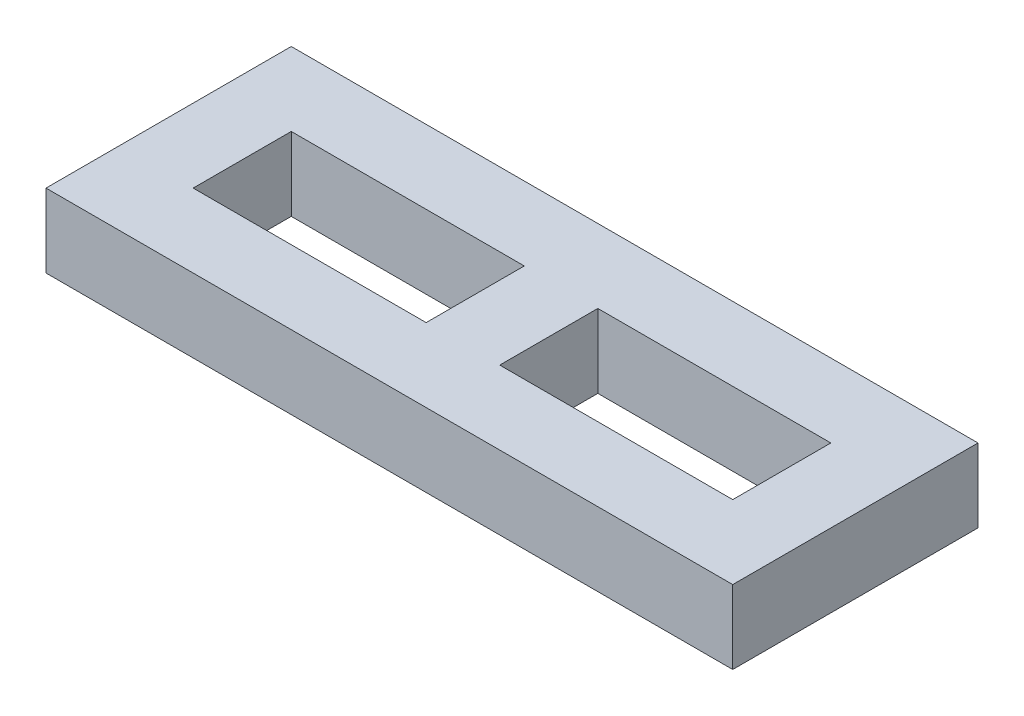
ISO-10303-21;
HEADER;
FILE_DESCRIPTION(('STEP AP214'),'2;1');
FILE_NAME('part.step','',(''),(''),'','','');
FILE_SCHEMA(('AUTOMOTIVE_DESIGN { 1 0 10303 214 1 1 1 1 }'));
ENDSEC;
DATA;
#1=APPLICATION_CONTEXT('core data for automotive mechanical design processes');
#2=APPLICATION_PROTOCOL_DEFINITION('international standard','automotive_design',2000,#1);
#3=PRODUCT_CONTEXT('',#1,'mechanical');
#4=PRODUCT('Part','Part','',(#3));
#5=PRODUCT_RELATED_PRODUCT_CATEGORY('part','',(#4));
#6=PRODUCT_DEFINITION_FORMATION('','',#4);
#7=PRODUCT_DEFINITION_CONTEXT('part definition',#1,'design');
#8=PRODUCT_DEFINITION('design','',#6,#7);
#9=PRODUCT_DEFINITION_SHAPE('','',#8);
#10=(LENGTH_UNIT() NAMED_UNIT(*) SI_UNIT(.MILLI.,.METRE.));
#11=(NAMED_UNIT(*) PLANE_ANGLE_UNIT() SI_UNIT($,.RADIAN.));
#12=(NAMED_UNIT(*) SI_UNIT($,.STERADIAN.) SOLID_ANGLE_UNIT());
#13=UNCERTAINTY_MEASURE_WITH_UNIT(LENGTH_MEASURE(1.E-05),#10,'distance_accuracy_value','');
#14=(GEOMETRIC_REPRESENTATION_CONTEXT(3) GLOBAL_UNCERTAINTY_ASSIGNED_CONTEXT((#13)) GLOBAL_UNIT_ASSIGNED_CONTEXT((#10,
#11,#12)) REPRESENTATION_CONTEXT('',''));
#15=CARTESIAN_POINT('',(0.,0.,0.));
#16=DIRECTION('',(0.,0.,1.));
#17=DIRECTION('',(1.,0.,0.));
#18=AXIS2_PLACEMENT_3D('',#15,#16,#17);
#19=CARTESIAN_POINT('',(88.9,-9.525,-31.75));
#20=DIRECTION('',(0.,0.,1.));
#21=DIRECTION('',(1.,0.,0.));
#22=AXIS2_PLACEMENT_3D('',#19,#20,#21);
#23=PLANE('',#22);
#24=DIRECTION('',(0.,1.,0.));
#25=VECTOR('',#24,1.);
#26=CARTESIAN_POINT('',(-88.9,-9.525,-31.75));
#27=LINE('',#26,#25);
#28=CARTESIAN_POINT('',(-88.9,-9.525,-31.75));
#29=VERTEX_POINT('',#28);
#30=CARTESIAN_POINT('',(-88.9,9.525,-31.75));
#31=VERTEX_POINT('',#30);
#32=EDGE_CURVE('E184',#29,#31,#27,.T.);
#33=ORIENTED_EDGE('',*,*,#32,.T.);
#34=DIRECTION('',(-1.,0.,0.));
#35=VECTOR('',#34,1.);
#36=CARTESIAN_POINT('',(88.9,9.525,-31.75));
#37=LINE('',#36,#35);
#38=CARTESIAN_POINT('',(88.9,9.525,-31.75));
#39=VERTEX_POINT('',#38);
#40=EDGE_CURVE('E11',#39,#31,#37,.T.);
#41=ORIENTED_EDGE('',*,*,#40,.F.);
#42=DIRECTION('',(0.,1.,0.));
#43=VECTOR('',#42,1.);
#44=CARTESIAN_POINT('',(88.9,-9.525,-31.75));
#45=LINE('',#44,#43);
#46=CARTESIAN_POINT('',(88.9,-9.525,-31.75));
#47=VERTEX_POINT('',#46);
#48=EDGE_CURVE('E191',#47,#39,#45,.T.);
#49=ORIENTED_EDGE('',*,*,#48,.F.);
#50=DIRECTION('',(-1.,0.,0.));
#51=VECTOR('',#50,1.);
#52=CARTESIAN_POINT('',(88.9,-9.525,-31.75));
#53=LINE('',#52,#51);
#54=EDGE_CURVE('E201',#47,#29,#53,.T.);
#55=ORIENTED_EDGE('',*,*,#54,.T.);
#56=EDGE_LOOP('',(#33,#41,#49,#55));
#57=FACE_BOUND('',#56,.T.);
#58=ADVANCED_FACE('F34',(#57),#23,.F.);
#59=CARTESIAN_POINT('',(88.9,9.525,31.75));
#60=DIRECTION('',(0.,-1.,0.));
#61=DIRECTION('',(0.,0.,-1.));
#62=AXIS2_PLACEMENT_3D('',#59,#60,#61);
#63=PLANE('',#62);
#64=DIRECTION('',(1.,0.,0.));
#65=VECTOR('',#64,1.);
#66=CARTESIAN_POINT('',(9.525,9.525,12.7));
#67=LINE('',#66,#65);
#68=CARTESIAN_POINT('',(9.52500000000001,9.525,12.7));
#69=VERTEX_POINT('',#68);
#70=CARTESIAN_POINT('',(69.85,9.525,12.7));
#71=VERTEX_POINT('',#70);
#72=EDGE_CURVE('E149',#69,#71,#67,.T.);
#73=ORIENTED_EDGE('',*,*,#72,.F.);
#74=DIRECTION('',(0.,0.,1.));
#75=VECTOR('',#74,1.);
#76=CARTESIAN_POINT('',(9.525,9.525,-12.7));
#77=LINE('',#76,#75);
#78=CARTESIAN_POINT('',(9.525,9.525,-12.7));
#79=VERTEX_POINT('',#78);
#80=EDGE_CURVE('E48',#79,#69,#77,.T.);
#81=ORIENTED_EDGE('',*,*,#80,.F.);
#82=DIRECTION('',(-1.,0.,0.));
#83=VECTOR('',#82,1.);
#84=CARTESIAN_POINT('',(9.525,9.525,-12.7));
#85=LINE('',#84,#83);
#86=CARTESIAN_POINT('',(69.85,9.525,-12.7));
#87=VERTEX_POINT('',#86);
#88=EDGE_CURVE('E140',#87,#79,#85,.T.);
#89=ORIENTED_EDGE('',*,*,#88,.F.);
#90=DIRECTION('',(0.,0.,-1.));
#91=VECTOR('',#90,1.);
#92=CARTESIAN_POINT('',(69.85,9.525,-12.7));
#93=LINE('',#92,#91);
#94=EDGE_CURVE('E143',#71,#87,#93,.T.);
#95=ORIENTED_EDGE('',*,*,#94,.F.);
#96=EDGE_LOOP('',(#73,#81,#89,#95));
#97=FACE_BOUND('',#96,.T.);
#98=DIRECTION('',(1.,0.,0.));
#99=VECTOR('',#98,1.);
#100=CARTESIAN_POINT('',(-69.85,9.525,12.7));
#101=LINE('',#100,#99);
#102=CARTESIAN_POINT('',(-69.85,9.525,12.7));
#103=VERTEX_POINT('',#102);
#104=CARTESIAN_POINT('',(-9.525,9.525,12.7));
#105=VERTEX_POINT('',#104);
#106=EDGE_CURVE('E174',#103,#105,#101,.T.);
#107=ORIENTED_EDGE('',*,*,#106,.F.);
#108=DIRECTION('',(0.,0.,1.));
#109=VECTOR('',#108,1.);
#110=CARTESIAN_POINT('',(-69.85,9.525,-12.7));
#111=LINE('',#110,#109);
#112=CARTESIAN_POINT('',(-69.85,9.525,-12.7));
#113=VERTEX_POINT('',#112);
#114=EDGE_CURVE('E155',#113,#103,#111,.T.);
#115=ORIENTED_EDGE('',*,*,#114,.F.);
#116=DIRECTION('',(-1.,0.,0.));
#117=VECTOR('',#116,1.);
#118=CARTESIAN_POINT('',(-69.85,9.525,-12.7));
#119=LINE('',#118,#117);
#120=CARTESIAN_POINT('',(-9.525,9.525,-12.7));
#121=VERTEX_POINT('',#120);
#122=EDGE_CURVE('E163',#121,#113,#119,.T.);
#123=ORIENTED_EDGE('',*,*,#122,.F.);
#124=DIRECTION('',(0.,0.,-1.));
#125=VECTOR('',#124,1.);
#126=CARTESIAN_POINT('',(-9.525,9.525,-12.7));
#127=LINE('',#126,#125);
#128=EDGE_CURVE('E177',#105,#121,#127,.T.);
#129=ORIENTED_EDGE('',*,*,#128,.F.);
#130=EDGE_LOOP('',(#107,#115,#123,#129));
#131=FACE_BOUND('',#130,.T.);
#132=DIRECTION('',(0.,0.,1.));
#133=VECTOR('',#132,1.);
#134=CARTESIAN_POINT('',(-88.9,9.525,31.75));
#135=LINE('',#134,#133);
#136=CARTESIAN_POINT('',(-88.9,9.525,31.75));
#137=VERTEX_POINT('',#136);
#138=EDGE_CURVE('E204',#31,#137,#135,.T.);
#139=ORIENTED_EDGE('',*,*,#138,.T.);
#140=DIRECTION('',(-1.,0.,0.));
#141=VECTOR('',#140,1.);
#142=CARTESIAN_POINT('',(88.9,9.525,31.75));
#143=LINE('',#142,#141);
#144=CARTESIAN_POINT('',(88.9,9.525,31.75));
#145=VERTEX_POINT('',#144);
#146=EDGE_CURVE('E41',#145,#137,#143,.T.);
#147=ORIENTED_EDGE('',*,*,#146,.F.);
#148=DIRECTION('',(0.,0.,1.));
#149=VECTOR('',#148,1.);
#150=CARTESIAN_POINT('',(88.9,9.525,31.75));
#151=LINE('',#150,#149);
#152=EDGE_CURVE('E194',#39,#145,#151,.T.);
#153=ORIENTED_EDGE('',*,*,#152,.F.);
#154=ORIENTED_EDGE('',*,*,#40,.T.);
#155=EDGE_LOOP('',(#139,#147,#153,#154));
#156=FACE_BOUND('',#155,.T.);
#157=ADVANCED_FACE('F233',(#97,#131,#156),#63,.F.);
#158=CARTESIAN_POINT('',(88.9,-9.525,31.75));
#159=DIRECTION('',(0.,0.,-1.));
#160=DIRECTION('',(-1.,0.,0.));
#161=AXIS2_PLACEMENT_3D('',#158,#159,#160);
#162=PLANE('',#161);
#163=DIRECTION('',(0.,-1.,0.));
#164=VECTOR('',#163,1.);
#165=CARTESIAN_POINT('',(-88.9,-9.525,31.75));
#166=LINE('',#165,#164);
#167=CARTESIAN_POINT('',(-88.9,-9.525,31.75));
#168=VERTEX_POINT('',#167);
#169=EDGE_CURVE('E206',#137,#168,#166,.T.);
#170=ORIENTED_EDGE('',*,*,#169,.T.);
#171=DIRECTION('',(-1.,0.,0.));
#172=VECTOR('',#171,1.);
#173=CARTESIAN_POINT('',(88.9,-9.525,31.75));
#174=LINE('',#173,#172);
#175=CARTESIAN_POINT('',(88.9,-9.525,31.75));
#176=VERTEX_POINT('',#175);
#177=EDGE_CURVE('E211',#176,#168,#174,.T.);
#178=ORIENTED_EDGE('',*,*,#177,.F.);
#179=DIRECTION('',(0.,-1.,0.));
#180=VECTOR('',#179,1.);
#181=CARTESIAN_POINT('',(88.9,-9.525,31.75));
#182=LINE('',#181,#180);
#183=EDGE_CURVE('E197',#145,#176,#182,.T.);
#184=ORIENTED_EDGE('',*,*,#183,.F.);
#185=ORIENTED_EDGE('',*,*,#146,.T.);
#186=EDGE_LOOP('',(#170,#178,#184,#185));
#187=FACE_BOUND('',#186,.T.);
#188=ADVANCED_FACE('F218',(#187),#162,.F.);
#189=CARTESIAN_POINT('',(88.9,-9.525,31.75));
#190=DIRECTION('',(0.,1.,0.));
#191=DIRECTION('',(0.,0.,1.));
#192=AXIS2_PLACEMENT_3D('',#189,#190,#191);
#193=PLANE('',#192);
#194=DIRECTION('',(-1.,0.,0.));
#195=VECTOR('',#194,1.);
#196=CARTESIAN_POINT('',(9.525,-9.525,-12.7));
#197=LINE('',#196,#195);
#198=CARTESIAN_POINT('',(69.85,-9.525,-12.7));
#199=VERTEX_POINT('',#198);
#200=CARTESIAN_POINT('',(9.525,-9.525,-12.7));
#201=VERTEX_POINT('',#200);
#202=EDGE_CURVE('E130',#199,#201,#197,.T.);
#203=ORIENTED_EDGE('',*,*,#202,.T.);
#204=DIRECTION('',(0.,0.,1.));
#205=VECTOR('',#204,1.);
#206=CARTESIAN_POINT('',(9.525,-9.525,-12.7));
#207=LINE('',#206,#205);
#208=CARTESIAN_POINT('',(9.525,-9.525,12.7));
#209=VERTEX_POINT('',#208);
#210=EDGE_CURVE('E124',#201,#209,#207,.T.);
#211=ORIENTED_EDGE('',*,*,#210,.T.);
#212=DIRECTION('',(1.,0.,0.));
#213=VECTOR('',#212,1.);
#214=CARTESIAN_POINT('',(9.525,-9.525,12.7));
#215=LINE('',#214,#213);
#216=CARTESIAN_POINT('',(69.85,-9.525,12.7));
#217=VERTEX_POINT('',#216);
#218=EDGE_CURVE('E133',#209,#217,#215,.T.);
#219=ORIENTED_EDGE('',*,*,#218,.T.);
#220=DIRECTION('',(0.,0.,-1.));
#221=VECTOR('',#220,1.);
#222=CARTESIAN_POINT('',(69.85,-9.525,-12.7));
#223=LINE('',#222,#221);
#224=EDGE_CURVE('E56',#217,#199,#223,.T.);
#225=ORIENTED_EDGE('',*,*,#224,.T.);
#226=EDGE_LOOP('',(#203,#211,#219,#225));
#227=FACE_BOUND('',#226,.T.);
#228=DIRECTION('',(-1.,0.,0.));
#229=VECTOR('',#228,1.);
#230=CARTESIAN_POINT('',(-69.85,-9.525,-12.7));
#231=LINE('',#230,#229);
#232=CARTESIAN_POINT('',(-9.525,-9.525,-12.7));
#233=VERTEX_POINT('',#232);
#234=CARTESIAN_POINT('',(-69.85,-9.525,-12.7));
#235=VERTEX_POINT('',#234);
#236=EDGE_CURVE('E169',#233,#235,#231,.T.);
#237=ORIENTED_EDGE('',*,*,#236,.T.);
#238=DIRECTION('',(0.,0.,1.));
#239=VECTOR('',#238,1.);
#240=CARTESIAN_POINT('',(-69.85,-9.525,-12.7));
#241=LINE('',#240,#239);
#242=CARTESIAN_POINT('',(-69.85,-9.525,12.7));
#243=VERTEX_POINT('',#242);
#244=EDGE_CURVE('E159',#235,#243,#241,.T.);
#245=ORIENTED_EDGE('',*,*,#244,.T.);
#246=DIRECTION('',(1.,0.,0.));
#247=VECTOR('',#246,1.);
#248=CARTESIAN_POINT('',(-69.85,-9.525,12.7));
#249=LINE('',#248,#247);
#250=CARTESIAN_POINT('',(-9.52500000000001,-9.525,12.7));
#251=VERTEX_POINT('',#250);
#252=EDGE_CURVE('E162',#243,#251,#249,.T.);
#253=ORIENTED_EDGE('',*,*,#252,.T.);
#254=DIRECTION('',(0.,0.,-1.));
#255=VECTOR('',#254,1.);
#256=CARTESIAN_POINT('',(-9.525,-9.525,-12.7));
#257=LINE('',#256,#255);
#258=EDGE_CURVE('E166',#251,#233,#257,.T.);
#259=ORIENTED_EDGE('',*,*,#258,.T.);
#260=EDGE_LOOP('',(#237,#245,#253,#259));
#261=FACE_BOUND('',#260,.T.);
#262=DIRECTION('',(0.,0.,-1.));
#263=VECTOR('',#262,1.);
#264=CARTESIAN_POINT('',(-88.9,-9.525,31.75));
#265=LINE('',#264,#263);
#266=EDGE_CURVE('E195',#168,#29,#265,.T.);
#267=ORIENTED_EDGE('',*,*,#266,.T.);
#268=ORIENTED_EDGE('',*,*,#54,.F.);
#269=DIRECTION('',(0.,0.,-1.));
#270=VECTOR('',#269,1.);
#271=CARTESIAN_POINT('',(88.9,-9.525,31.75));
#272=LINE('',#271,#270);
#273=EDGE_CURVE('E199',#176,#47,#272,.T.);
#274=ORIENTED_EDGE('',*,*,#273,.F.);
#275=ORIENTED_EDGE('',*,*,#177,.T.);
#276=EDGE_LOOP('',(#267,#268,#274,#275));
#277=FACE_BOUND('',#276,.T.);
#278=ADVANCED_FACE('F137',(#227,#261,#277),#193,.F.);
#279=CARTESIAN_POINT('',(88.9,0.,0.));
#280=DIRECTION('',(-1.,0.,0.));
#281=DIRECTION('',(0.,0.,1.));
#282=AXIS2_PLACEMENT_3D('',#279,#280,#281);
#283=PLANE('',#282);
#284=ORIENTED_EDGE('',*,*,#48,.T.);
#285=ORIENTED_EDGE('',*,*,#152,.T.);
#286=ORIENTED_EDGE('',*,*,#183,.T.);
#287=ORIENTED_EDGE('',*,*,#273,.T.);
#288=EDGE_LOOP('',(#284,#285,#286,#287));
#289=FACE_BOUND('',#288,.T.);
#290=ADVANCED_FACE('F232',(#289),#283,.F.);
#291=CARTESIAN_POINT('',(-88.9,0.,0.));
#292=DIRECTION('',(-1.,0.,0.));
#293=DIRECTION('',(0.,0.,1.));
#294=AXIS2_PLACEMENT_3D('',#291,#292,#293);
#295=PLANE('',#294);
#296=ORIENTED_EDGE('',*,*,#32,.F.);
#297=ORIENTED_EDGE('',*,*,#266,.F.);
#298=ORIENTED_EDGE('',*,*,#169,.F.);
#299=ORIENTED_EDGE('',*,*,#138,.F.);
#300=EDGE_LOOP('',(#296,#297,#298,#299));
#301=FACE_BOUND('',#300,.T.);
#302=ADVANCED_FACE('F224',(#301),#295,.T.);
#303=CARTESIAN_POINT('',(-69.85,-9.525,-12.7));
#304=DIRECTION('',(-1.,0.,0.));
#305=DIRECTION('',(0.,0.,1.));
#306=AXIS2_PLACEMENT_3D('',#303,#304,#305);
#307=PLANE('',#306);
#308=ORIENTED_EDGE('',*,*,#114,.T.);
#309=DIRECTION('',(0.,1.,0.));
#310=VECTOR('',#309,1.);
#311=CARTESIAN_POINT('',(-69.85,-9.525,12.7));
#312=LINE('',#311,#310);
#313=EDGE_CURVE('E172',#243,#103,#312,.T.);
#314=ORIENTED_EDGE('',*,*,#313,.F.);
#315=ORIENTED_EDGE('',*,*,#244,.F.);
#316=DIRECTION('',(0.,1.,0.));
#317=VECTOR('',#316,1.);
#318=CARTESIAN_POINT('',(-69.85,-9.525,-12.7));
#319=LINE('',#318,#317);
#320=EDGE_CURVE('E182',#235,#113,#319,.T.);
#321=ORIENTED_EDGE('',*,*,#320,.T.);
#322=EDGE_LOOP('',(#308,#314,#315,#321));
#323=FACE_BOUND('',#322,.T.);
#324=ADVANCED_FACE('F247',(#323),#307,.F.);
#325=CARTESIAN_POINT('',(-69.85,-9.525,-12.7));
#326=DIRECTION('',(0.,0.,-1.));
#327=DIRECTION('',(-1.,0.,0.));
#328=AXIS2_PLACEMENT_3D('',#325,#326,#327);
#329=PLANE('',#328);
#330=ORIENTED_EDGE('',*,*,#122,.T.);
#331=ORIENTED_EDGE('',*,*,#320,.F.);
#332=ORIENTED_EDGE('',*,*,#236,.F.);
#333=DIRECTION('',(0.,1.,0.));
#334=VECTOR('',#333,1.);
#335=CARTESIAN_POINT('',(-9.525,-9.525,-12.7));
#336=LINE('',#335,#334);
#337=EDGE_CURVE('E185',#233,#121,#336,.T.);
#338=ORIENTED_EDGE('',*,*,#337,.T.);
#339=EDGE_LOOP('',(#330,#331,#332,#338));
#340=FACE_BOUND('',#339,.T.);
#341=ADVANCED_FACE('F252',(#340),#329,.F.);
#342=CARTESIAN_POINT('',(-9.525,-9.525,-12.7));
#343=DIRECTION('',(1.,0.,0.));
#344=DIRECTION('',(0.,0.,-1.));
#345=AXIS2_PLACEMENT_3D('',#342,#343,#344);
#346=PLANE('',#345);
#347=ORIENTED_EDGE('',*,*,#128,.T.);
#348=ORIENTED_EDGE('',*,*,#337,.F.);
#349=ORIENTED_EDGE('',*,*,#258,.F.);
#350=DIRECTION('',(0.,1.,0.));
#351=VECTOR('',#350,1.);
#352=CARTESIAN_POINT('',(-9.525,-9.525,12.7));
#353=LINE('',#352,#351);
#354=EDGE_CURVE('E187',#251,#105,#353,.T.);
#355=ORIENTED_EDGE('',*,*,#354,.T.);
#356=EDGE_LOOP('',(#347,#348,#349,#355));
#357=FACE_BOUND('',#356,.T.);
#358=ADVANCED_FACE('F257',(#357),#346,.F.);
#359=CARTESIAN_POINT('',(-69.85,-9.525,12.7));
#360=DIRECTION('',(0.,0.,1.));
#361=DIRECTION('',(1.,0.,0.));
#362=AXIS2_PLACEMENT_3D('',#359,#360,#361);
#363=PLANE('',#362);
#364=ORIENTED_EDGE('',*,*,#106,.T.);
#365=ORIENTED_EDGE('',*,*,#354,.F.);
#366=ORIENTED_EDGE('',*,*,#252,.F.);
#367=ORIENTED_EDGE('',*,*,#313,.T.);
#368=EDGE_LOOP('',(#364,#365,#366,#367));
#369=FACE_BOUND('',#368,.T.);
#370=ADVANCED_FACE('F254',(#369),#363,.F.);
#371=CARTESIAN_POINT('',(9.525,-9.525,-12.7));
#372=DIRECTION('',(-1.,0.,0.));
#373=DIRECTION('',(0.,0.,1.));
#374=AXIS2_PLACEMENT_3D('',#371,#372,#373);
#375=PLANE('',#374);
#376=ORIENTED_EDGE('',*,*,#80,.T.);
#377=DIRECTION('',(0.,1.,0.));
#378=VECTOR('',#377,1.);
#379=CARTESIAN_POINT('',(9.525,-9.525,12.7));
#380=LINE('',#379,#378);
#381=EDGE_CURVE('E120',#209,#69,#380,.T.);
#382=ORIENTED_EDGE('',*,*,#381,.F.);
#383=ORIENTED_EDGE('',*,*,#210,.F.);
#384=DIRECTION('',(0.,1.,0.));
#385=VECTOR('',#384,1.);
#386=CARTESIAN_POINT('',(9.525,-9.525,-12.7));
#387=LINE('',#386,#385);
#388=EDGE_CURVE('E153',#201,#79,#387,.T.);
#389=ORIENTED_EDGE('',*,*,#388,.T.);
#390=EDGE_LOOP('',(#376,#382,#383,#389));
#391=FACE_BOUND('',#390,.T.);
#392=ADVANCED_FACE('F122',(#391),#375,.F.);
#393=CARTESIAN_POINT('',(9.525,-9.525,-12.7));
#394=DIRECTION('',(0.,0.,-1.));
#395=DIRECTION('',(-1.,0.,0.));
#396=AXIS2_PLACEMENT_3D('',#393,#394,#395);
#397=PLANE('',#396);
#398=ORIENTED_EDGE('',*,*,#88,.T.);
#399=ORIENTED_EDGE('',*,*,#388,.F.);
#400=ORIENTED_EDGE('',*,*,#202,.F.);
#401=DIRECTION('',(0.,1.,0.));
#402=VECTOR('',#401,1.);
#403=CARTESIAN_POINT('',(69.85,-9.525,-12.7));
#404=LINE('',#403,#402);
#405=EDGE_CURVE('E156',#199,#87,#404,.T.);
#406=ORIENTED_EDGE('',*,*,#405,.T.);
#407=EDGE_LOOP('',(#398,#399,#400,#406));
#408=FACE_BOUND('',#407,.T.);
#409=ADVANCED_FACE('F267',(#408),#397,.F.);
#410=CARTESIAN_POINT('',(69.85,-9.525,-12.7));
#411=DIRECTION('',(1.,0.,0.));
#412=DIRECTION('',(0.,0.,-1.));
#413=AXIS2_PLACEMENT_3D('',#410,#411,#412);
#414=PLANE('',#413);
#415=ORIENTED_EDGE('',*,*,#94,.T.);
#416=ORIENTED_EDGE('',*,*,#405,.F.);
#417=ORIENTED_EDGE('',*,*,#224,.F.);
#418=DIRECTION('',(0.,1.,0.));
#419=VECTOR('',#418,1.);
#420=CARTESIAN_POINT('',(69.85,-9.525,12.7));
#421=LINE('',#420,#419);
#422=EDGE_CURVE('E129',#217,#71,#421,.T.);
#423=ORIENTED_EDGE('',*,*,#422,.T.);
#424=EDGE_LOOP('',(#415,#416,#417,#423));
#425=FACE_BOUND('',#424,.T.);
#426=ADVANCED_FACE('F270',(#425),#414,.F.);
#427=CARTESIAN_POINT('',(9.525,-9.525,12.7));
#428=DIRECTION('',(0.,0.,1.));
#429=DIRECTION('',(1.,0.,0.));
#430=AXIS2_PLACEMENT_3D('',#427,#428,#429);
#431=PLANE('',#430);
#432=ORIENTED_EDGE('',*,*,#72,.T.);
#433=ORIENTED_EDGE('',*,*,#422,.F.);
#434=ORIENTED_EDGE('',*,*,#218,.F.);
#435=ORIENTED_EDGE('',*,*,#381,.T.);
#436=EDGE_LOOP('',(#432,#433,#434,#435));
#437=FACE_BOUND('',#436,.T.);
#438=ADVANCED_FACE('F134',(#437),#431,.F.);
#439=CLOSED_SHELL('',(#58,#157,#188,#278,#290,#302,#324,#341,#358,#370,#392,#409,#426,#438));
#440=MANIFOLD_SOLID_BREP('B2',#439);
#441=ADVANCED_BREP_SHAPE_REPRESENTATION('',(#18,#440),#14);
#442=SHAPE_DEFINITION_REPRESENTATION(#9,#441);
ENDSEC;
END-ISO-10303-21;
